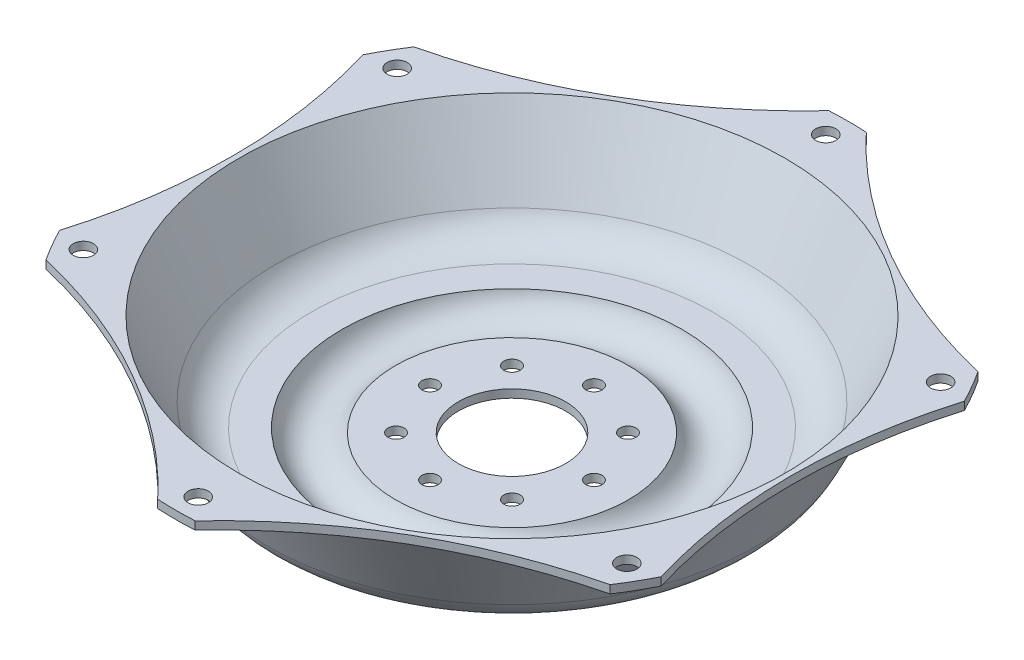
ISO-10303-21;
HEADER;
FILE_DESCRIPTION(('STEP AP214'),'2;1');
FILE_NAME('part.step','',(''),(''),'','','');
FILE_SCHEMA(('AUTOMOTIVE_DESIGN { 1 0 10303 214 1 1 1 1 }'));
ENDSEC;
DATA;
#1=APPLICATION_CONTEXT('core data for automotive mechanical design processes');
#2=APPLICATION_PROTOCOL_DEFINITION('international standard','automotive_design',2000,#1);
#3=PRODUCT_CONTEXT('',#1,'mechanical');
#4=PRODUCT('Part','Part','',(#3));
#5=PRODUCT_RELATED_PRODUCT_CATEGORY('part','',(#4));
#6=PRODUCT_DEFINITION_FORMATION('','',#4);
#7=PRODUCT_DEFINITION_CONTEXT('part definition',#1,'design');
#8=PRODUCT_DEFINITION('design','',#6,#7);
#9=PRODUCT_DEFINITION_SHAPE('','',#8);
#10=(LENGTH_UNIT() NAMED_UNIT(*) SI_UNIT(.MILLI.,.METRE.));
#11=(NAMED_UNIT(*) PLANE_ANGLE_UNIT() SI_UNIT($,.RADIAN.));
#12=(NAMED_UNIT(*) SI_UNIT($,.STERADIAN.) SOLID_ANGLE_UNIT());
#13=UNCERTAINTY_MEASURE_WITH_UNIT(LENGTH_MEASURE(1.E-05),#10,'distance_accuracy_value','');
#14=(GEOMETRIC_REPRESENTATION_CONTEXT(3) GLOBAL_UNCERTAINTY_ASSIGNED_CONTEXT((#13)) GLOBAL_UNIT_ASSIGNED_CONTEXT((#10,
#11,#12)) REPRESENTATION_CONTEXT('',''));
#15=CARTESIAN_POINT('',(0.,0.,0.));
#16=DIRECTION('',(0.,0.,1.));
#17=DIRECTION('',(1.,0.,0.));
#18=AXIS2_PLACEMENT_3D('',#15,#16,#17);
#19=CARTESIAN_POINT('',(0.,100.,0.));
#20=DIRECTION('',(0.,1.,0.));
#21=DIRECTION('',(0.,0.,1.));
#22=AXIS2_PLACEMENT_3D('',#19,#20,#21);
#23=CYLINDRICAL_SURFACE('',#22,332.5);
#24=CARTESIAN_POINT('',(0.,100.,0.));
#25=DIRECTION('',(0.,1.,0.));
#26=DIRECTION('',(0.,0.,1.));
#27=AXIS2_PLACEMENT_3D('',#24,#25,#26);
#28=CIRCLE('',#27,332.5);
#29=CARTESIAN_POINT('',(278.531193959891,100.,181.594669501276));
#30=VERTEX_POINT('',#29);
#31=CARTESIAN_POINT('',(296.953684892086,100.,149.581947537167));
#32=VERTEX_POINT('',#31);
#33=EDGE_CURVE('E159',#30,#32,#28,.T.);
#34=ORIENTED_EDGE('',*,*,#33,.F.);
#35=DIRECTION('',(0.,-1.,0.));
#36=VECTOR('',#35,1.);
#37=CARTESIAN_POINT('',(278.531193959891,100.,181.594669501276));
#38=LINE('',#37,#36);
#39=CARTESIAN_POINT('',(278.531193959891,92.,181.594669501276));
#40=VERTEX_POINT('',#39);
#41=EDGE_CURVE('E144',#30,#40,#38,.T.);
#42=ORIENTED_EDGE('',*,*,#41,.T.);
#43=CARTESIAN_POINT('',(0.,92.,0.));
#44=DIRECTION('',(0.,1.,0.));
#45=DIRECTION('',(0.,0.,1.));
#46=AXIS2_PLACEMENT_3D('',#43,#44,#45);
#47=CIRCLE('',#46,332.5);
#48=CARTESIAN_POINT('',(296.953684892086,92.,149.581947537167));
#49=VERTEX_POINT('',#48);
#50=EDGE_CURVE('E157',#40,#49,#47,.T.);
#51=ORIENTED_EDGE('',*,*,#50,.T.);
#52=DIRECTION('',(0.,-1.,0.));
#53=VECTOR('',#52,1.);
#54=CARTESIAN_POINT('',(296.953684892086,100.,149.581947537167));
#55=LINE('',#54,#53);
#56=EDGE_CURVE('E261',#32,#49,#55,.T.);
#57=ORIENTED_EDGE('',*,*,#56,.F.);
#58=EDGE_LOOP('',(#34,#42,#51,#57));
#59=FACE_BOUND('',#58,.T.);
#60=ADVANCED_FACE('F36',(#59),#23,.T.);
#61=CARTESIAN_POINT('',(-18.0000000000001,92.,332.012424466314));
#62=VERTEX_POINT('',#61);
#63=CARTESIAN_POINT('',(18.9350759313039,92.,331.960408632529));
#64=VERTEX_POINT('',#63);
#65=EDGE_CURVE('E165',#62,#64,#47,.T.);
#66=ORIENTED_EDGE('',*,*,#65,.T.);
#67=DIRECTION('',(0.,-1.,0.));
#68=VECTOR('',#67,1.);
#69=CARTESIAN_POINT('',(18.9350759313039,100.,331.960408632529));
#70=LINE('',#69,#68);
#71=CARTESIAN_POINT('',(18.9350759313039,100.,331.960408632529));
#72=VERTEX_POINT('',#71);
#73=EDGE_CURVE('E217',#72,#64,#70,.T.);
#74=ORIENTED_EDGE('',*,*,#73,.F.);
#75=CARTESIAN_POINT('',(-18.0000000000001,100.,332.012424466314));
#76=VERTEX_POINT('',#75);
#77=EDGE_CURVE('E207',#76,#72,#28,.T.);
#78=ORIENTED_EDGE('',*,*,#77,.F.);
#79=DIRECTION('',(0.,-1.,0.));
#80=VECTOR('',#79,1.);
#81=CARTESIAN_POINT('',(-18.0000000000001,100.,332.012424466314));
#82=LINE('',#81,#80);
#83=EDGE_CURVE('E221',#76,#62,#82,.T.);
#84=ORIENTED_EDGE('',*,*,#83,.T.);
#85=EDGE_LOOP('',(#66,#74,#78,#84));
#86=FACE_BOUND('',#85,.T.);
#87=ADVANCED_FACE('F395',(#86),#23,.T.);
#88=CARTESIAN_POINT('',(296.53119395989,100.,-150.417754965039));
#89=VERTEX_POINT('',#88);
#90=CARTESIAN_POINT('',(278.018608960782,100.,-182.37846109536));
#91=VERTEX_POINT('',#90);
#92=EDGE_CURVE('E426',#89,#91,#28,.T.);
#93=ORIENTED_EDGE('',*,*,#92,.F.);
#94=DIRECTION('',(0.,-1.,0.));
#95=VECTOR('',#94,1.);
#96=CARTESIAN_POINT('',(296.53119395989,100.,-150.417754965039));
#97=LINE('',#96,#95);
#98=CARTESIAN_POINT('',(296.53119395989,92.,-150.417754965039));
#99=VERTEX_POINT('',#98);
#100=EDGE_CURVE('E265',#89,#99,#97,.T.);
#101=ORIENTED_EDGE('',*,*,#100,.T.);
#102=CARTESIAN_POINT('',(278.018608960782,92.,-182.37846109536));
#103=VERTEX_POINT('',#102);
#104=EDGE_CURVE('E166',#99,#103,#47,.T.);
#105=ORIENTED_EDGE('',*,*,#104,.T.);
#106=DIRECTION('',(0.,-1.,0.));
#107=VECTOR('',#106,1.);
#108=CARTESIAN_POINT('',(278.018608960782,100.,-182.37846109536));
#109=LINE('',#108,#107);
#110=EDGE_CURVE('E251',#91,#103,#109,.T.);
#111=ORIENTED_EDGE('',*,*,#110,.F.);
#112=EDGE_LOOP('',(#93,#101,#105,#111));
#113=FACE_BOUND('',#112,.T.);
#114=ADVANCED_FACE('F400',(#113),#23,.T.);
#115=CARTESIAN_POINT('',(18.0000000000001,100.,-332.012424466314));
#116=VERTEX_POINT('',#115);
#117=CARTESIAN_POINT('',(-18.9350759313062,100.,-331.960408632529));
#118=VERTEX_POINT('',#117);
#119=EDGE_CURVE('E422',#116,#118,#28,.T.);
#120=ORIENTED_EDGE('',*,*,#119,.F.);
#121=DIRECTION('',(0.,-1.,0.));
#122=VECTOR('',#121,1.);
#123=CARTESIAN_POINT('',(18.0000000000001,100.,-332.012424466314));
#124=LINE('',#123,#122);
#125=CARTESIAN_POINT('',(18.0000000000001,92.,-332.012424466314));
#126=VERTEX_POINT('',#125);
#127=EDGE_CURVE('E255',#116,#126,#124,.T.);
#128=ORIENTED_EDGE('',*,*,#127,.T.);
#129=CARTESIAN_POINT('',(-18.9350759313062,92.,-331.960408632529));
#130=VERTEX_POINT('',#129);
#131=EDGE_CURVE('E171',#126,#130,#47,.T.);
#132=ORIENTED_EDGE('',*,*,#131,.T.);
#133=DIRECTION('',(0.,-1.,0.));
#134=VECTOR('',#133,1.);
#135=CARTESIAN_POINT('',(-18.9350759313062,100.,-331.960408632529));
#136=LINE('',#135,#134);
#137=EDGE_CURVE('E241',#118,#130,#136,.T.);
#138=ORIENTED_EDGE('',*,*,#137,.F.);
#139=EDGE_LOOP('',(#120,#128,#132,#138));
#140=FACE_BOUND('',#139,.T.);
#141=ADVANCED_FACE('F412',(#140),#23,.T.);
#142=CARTESIAN_POINT('',(-278.531193959892,100.,-181.594669501274));
#143=VERTEX_POINT('',#142);
#144=CARTESIAN_POINT('',(-296.953684892087,100.,-149.581947537165));
#145=VERTEX_POINT('',#144);
#146=EDGE_CURVE('E420',#143,#145,#28,.T.);
#147=ORIENTED_EDGE('',*,*,#146,.F.);
#148=DIRECTION('',(0.,-1.,0.));
#149=VECTOR('',#148,1.);
#150=CARTESIAN_POINT('',(-278.531193959892,100.,-181.594669501274));
#151=LINE('',#150,#149);
#152=CARTESIAN_POINT('',(-278.531193959892,92.,-181.594669501274));
#153=VERTEX_POINT('',#152);
#154=EDGE_CURVE('E246',#143,#153,#151,.T.);
#155=ORIENTED_EDGE('',*,*,#154,.T.);
#156=CARTESIAN_POINT('',(-296.953684892087,92.,-149.581947537165));
#157=VERTEX_POINT('',#156);
#158=EDGE_CURVE('E858',#153,#157,#47,.T.);
#159=ORIENTED_EDGE('',*,*,#158,.T.);
#160=DIRECTION('',(0.,-1.,0.));
#161=VECTOR('',#160,1.);
#162=CARTESIAN_POINT('',(-296.953684892087,100.,-149.581947537165));
#163=LINE('',#162,#161);
#164=EDGE_CURVE('E232',#145,#157,#163,.T.);
#165=ORIENTED_EDGE('',*,*,#164,.F.);
#166=EDGE_LOOP('',(#147,#155,#159,#165));
#167=FACE_BOUND('',#166,.T.);
#168=ADVANCED_FACE('F404',(#167),#23,.T.);
#169=CARTESIAN_POINT('',(-296.531193959889,100.,150.417754965041));
#170=VERTEX_POINT('',#169);
#171=CARTESIAN_POINT('',(-278.018608960782,100.,182.37846109536));
#172=VERTEX_POINT('',#171);
#173=EDGE_CURVE('E210',#170,#172,#28,.T.);
#174=ORIENTED_EDGE('',*,*,#173,.F.);
#175=DIRECTION('',(0.,-1.,0.));
#176=VECTOR('',#175,1.);
#177=CARTESIAN_POINT('',(-296.531193959889,100.,150.417754965041));
#178=LINE('',#177,#176);
#179=CARTESIAN_POINT('',(-296.531193959889,92.,150.417754965041));
#180=VERTEX_POINT('',#179);
#181=EDGE_CURVE('E236',#170,#180,#178,.T.);
#182=ORIENTED_EDGE('',*,*,#181,.T.);
#183=CARTESIAN_POINT('',(-278.018608960782,92.,182.37846109536));
#184=VERTEX_POINT('',#183);
#185=EDGE_CURVE('E169',#180,#184,#47,.T.);
#186=ORIENTED_EDGE('',*,*,#185,.T.);
#187=DIRECTION('',(0.,-1.,0.));
#188=VECTOR('',#187,1.);
#189=CARTESIAN_POINT('',(-278.018608960782,100.,182.37846109536));
#190=LINE('',#189,#188);
#191=EDGE_CURVE('E224',#172,#184,#190,.T.);
#192=ORIENTED_EDGE('',*,*,#191,.F.);
#193=EDGE_LOOP('',(#174,#182,#186,#192));
#194=FACE_BOUND('',#193,.T.);
#195=ADVANCED_FACE('F396',(#194),#23,.T.);
#196=CARTESIAN_POINT('',(269.721959046056,92.,0.));
#197=DIRECTION('',(0.,1.,0.));
#198=DIRECTION('',(0.,0.,1.));
#199=AXIS2_PLACEMENT_3D('',#196,#197,#198);
#200=PLANE('',#199);
#201=CARTESIAN_POINT('',(399.265539041086,92.,689.304522403098));
#202=DIRECTION('',(0.,-1.,0.));
#203=DIRECTION('',(-0.86602540378444,0.,-0.499999999999998));
#204=AXIS2_PLACEMENT_3D('',#201,#202,#203);
#205=CIRCLE('',#204,521.867872948484);
#206=CARTESIAN_POINT('',(137.695377558574,92.,237.721609265558));
#207=VERTEX_POINT('',#206);
#208=EDGE_CURVE('E147',#207,#64,#205,.F.);
#209=ORIENTED_EDGE('',*,*,#208,.T.);
#210=ORIENTED_EDGE('',*,*,#65,.F.);
#211=CARTESIAN_POINT('',(-397.322457824042,92.,690.426360866816));
#212=DIRECTION('',(0.,-1.,0.));
#213=DIRECTION('',(0.,0.,-1.));
#214=AXIS2_PLACEMENT_3D('',#211,#212,#213);
#215=CIRCLE('',#214,521.867872948484);
#216=CARTESIAN_POINT('',(-137.025263873205,92.,238.108499582194));
#217=VERTEX_POINT('',#216);
#218=EDGE_CURVE('E220',#62,#217,#215,.F.);
#219=ORIENTED_EDGE('',*,*,#218,.T.);
#220=CARTESIAN_POINT('',(0.,92.,0.));
#221=DIRECTION('',(0.,1.,0.));
#222=DIRECTION('',(0.,0.,1.));
#223=AXIS2_PLACEMENT_3D('',#220,#221,#222);
#224=CIRCLE('',#223,274.720913861331);
#225=EDGE_CURVE('E178',#217,#207,#224,.T.);
#226=ORIENTED_EDGE('',*,*,#225,.T.);
#227=EDGE_LOOP('',(#209,#210,#219,#226));
#228=FACE_BOUND('',#227,.T.);
#229=CARTESIAN_POINT('',(0.,92.,310.));
#230=DIRECTION('',(0.,-1.,0.));
#231=DIRECTION('',(0.,0.,-1.));
#232=AXIS2_PLACEMENT_3D('',#229,#230,#231);
#233=CIRCLE('',#232,10.);
#234=CARTESIAN_POINT('',(0.,92.,300.));
#235=VERTEX_POINT('',#234);
#236=EDGE_CURVE('E213',#235,#235,#233,.T.);
#237=ORIENTED_EDGE('',*,*,#236,.F.);
#238=EDGE_LOOP('',(#237));
#239=FACE_BOUND('',#238,.T.);
#240=ADVANCED_FACE('F403',(#228,#239),#200,.F.);
#241=CARTESIAN_POINT('',(268.467875173176,92.,154.999999999999));
#242=DIRECTION('',(0.,-1.,0.));
#243=DIRECTION('',(-0.86602540378444,0.,-0.499999999999998));
#244=AXIS2_PLACEMENT_3D('',#241,#242,#243);
#245=CIRCLE('',#244,10.);
#246=CARTESIAN_POINT('',(259.807621135332,92.,149.999999999999));
#247=VERTEX_POINT('',#246);
#248=EDGE_CURVE('E273',#247,#247,#245,.T.);
#249=ORIENTED_EDGE('',*,*,#248,.F.);
#250=EDGE_LOOP('',(#249));
#251=FACE_BOUND('',#250,.T.);
#252=EDGE_CURVE('E141',#40,#207,#205,.F.);
#253=ORIENTED_EDGE('',*,*,#252,.T.);
#254=CARTESIAN_POINT('',(274.720641431778,92.,-0.386890316636765));
#255=VERTEX_POINT('',#254);
#256=EDGE_CURVE('E181',#207,#255,#224,.T.);
#257=ORIENTED_EDGE('',*,*,#256,.T.);
#258=CARTESIAN_POINT('',(796.587996865126,92.,-1.12183846372071));
#259=DIRECTION('',(0.,-1.,0.));
#260=DIRECTION('',(-0.866025403784436,0.,0.500000000000004));
#261=AXIS2_PLACEMENT_3D('',#258,#259,#260);
#262=CIRCLE('',#261,521.867872948484);
#263=EDGE_CURVE('E164',#255,#49,#262,.F.);
#264=ORIENTED_EDGE('',*,*,#263,.T.);
#265=ORIENTED_EDGE('',*,*,#50,.F.);
#266=EDGE_LOOP('',(#253,#257,#264,#265));
#267=FACE_BOUND('',#266,.T.);
#268=ADVANCED_FACE('F163',(#251,#267),#200,.F.);
#269=CARTESIAN_POINT('',(268.467875173175,92.,-155.000000000001));
#270=DIRECTION('',(0.,-1.,0.));
#271=DIRECTION('',(-0.866025403784436,0.,0.500000000000004));
#272=AXIS2_PLACEMENT_3D('',#269,#270,#271);
#273=CIRCLE('',#272,10.);
#274=CARTESIAN_POINT('',(259.807621135331,92.,-150.000000000001));
#275=VERTEX_POINT('',#274);
#276=EDGE_CURVE('E279',#275,#275,#273,.T.);
#277=ORIENTED_EDGE('',*,*,#276,.F.);
#278=EDGE_LOOP('',(#277));
#279=FACE_BOUND('',#278,.T.);
#280=EDGE_CURVE('E268',#99,#255,#262,.F.);
#281=ORIENTED_EDGE('',*,*,#280,.T.);
#282=CARTESIAN_POINT('',(137.025263873205,92.,-238.108499582194));
#283=VERTEX_POINT('',#282);
#284=EDGE_CURVE('E447',#255,#283,#224,.T.);
#285=ORIENTED_EDGE('',*,*,#284,.T.);
#286=CARTESIAN_POINT('',(397.322457824042,92.,-690.426360866816));
#287=DIRECTION('',(0.,-1.,0.));
#288=DIRECTION('',(0.,0.,1.));
#289=AXIS2_PLACEMENT_3D('',#286,#287,#288);
#290=CIRCLE('',#289,521.867872948484);
#291=EDGE_CURVE('E243',#283,#103,#290,.F.);
#292=ORIENTED_EDGE('',*,*,#291,.T.);
#293=ORIENTED_EDGE('',*,*,#104,.F.);
#294=EDGE_LOOP('',(#281,#285,#292,#293));
#295=FACE_BOUND('',#294,.T.);
#296=ADVANCED_FACE('F584',(#279,#295),#200,.F.);
#297=CARTESIAN_POINT('',(0.,92.,-310.));
#298=DIRECTION('',(0.,-1.,0.));
#299=DIRECTION('',(0.,0.,1.));
#300=AXIS2_PLACEMENT_3D('',#297,#298,#299);
#301=CIRCLE('',#300,10.);
#302=CARTESIAN_POINT('',(0.,92.,-300.));
#303=VERTEX_POINT('',#302);
#304=EDGE_CURVE('E294',#303,#303,#301,.T.);
#305=ORIENTED_EDGE('',*,*,#304,.F.);
#306=EDGE_LOOP('',(#305));
#307=FACE_BOUND('',#306,.T.);
#308=EDGE_CURVE('E258',#126,#283,#290,.F.);
#309=ORIENTED_EDGE('',*,*,#308,.T.);
#310=CARTESIAN_POINT('',(-137.695377558576,92.,-237.721609265557));
#311=VERTEX_POINT('',#310);
#312=EDGE_CURVE('E448',#283,#311,#224,.T.);
#313=ORIENTED_EDGE('',*,*,#312,.T.);
#314=CARTESIAN_POINT('',(-399.265539041091,92.,-689.304522403096));
#315=DIRECTION('',(0.,-1.,0.));
#316=DIRECTION('',(0.866025403784443,0.,0.499999999999992));
#317=AXIS2_PLACEMENT_3D('',#314,#315,#316);
#318=CIRCLE('',#317,521.867872948484);
#319=EDGE_CURVE('E58',#311,#130,#318,.F.);
#320=ORIENTED_EDGE('',*,*,#319,.T.);
#321=ORIENTED_EDGE('',*,*,#131,.F.);
#322=EDGE_LOOP('',(#309,#313,#320,#321));
#323=FACE_BOUND('',#322,.T.);
#324=ADVANCED_FACE('F576',(#307,#323),#200,.F.);
#325=CARTESIAN_POINT('',(-268.467875173177,92.,-154.999999999997));
#326=DIRECTION('',(0.,-1.,0.));
#327=DIRECTION('',(0.866025403784443,0.,0.499999999999992));
#328=AXIS2_PLACEMENT_3D('',#325,#326,#327);
#329=CIRCLE('',#328,10.);
#330=CARTESIAN_POINT('',(-259.807621135333,92.,-149.999999999998));
#331=VERTEX_POINT('',#330);
#332=EDGE_CURVE('E288',#331,#331,#329,.T.);
#333=ORIENTED_EDGE('',*,*,#332,.F.);
#334=EDGE_LOOP('',(#333));
#335=FACE_BOUND('',#334,.T.);
#336=EDGE_CURVE('E249',#153,#311,#318,.F.);
#337=ORIENTED_EDGE('',*,*,#336,.T.);
#338=CARTESIAN_POINT('',(-274.720641431778,92.,0.386890316638699));
#339=VERTEX_POINT('',#338);
#340=EDGE_CURVE('E452',#311,#339,#224,.T.);
#341=ORIENTED_EDGE('',*,*,#340,.T.);
#342=CARTESIAN_POINT('',(-796.587996865126,92.,1.12183846372632));
#343=DIRECTION('',(0.,-1.,0.));
#344=DIRECTION('',(0.866025403784433,0.,-0.50000000000001));
#345=AXIS2_PLACEMENT_3D('',#342,#343,#344);
#346=CIRCLE('',#345,521.867872948484);
#347=EDGE_CURVE('E50',#339,#157,#346,.F.);
#348=ORIENTED_EDGE('',*,*,#347,.T.);
#349=ORIENTED_EDGE('',*,*,#158,.F.);
#350=EDGE_LOOP('',(#337,#341,#348,#349));
#351=FACE_BOUND('',#350,.T.);
#352=ADVANCED_FACE('F474',(#335,#351),#200,.F.);
#353=CARTESIAN_POINT('',(269.721959046056,100.,0.));
#354=DIRECTION('',(0.,1.,0.));
#355=DIRECTION('',(0.,0.,1.));
#356=AXIS2_PLACEMENT_3D('',#353,#354,#355);
#357=PLANE('',#356);
#358=CARTESIAN_POINT('',(-268.467875173174,100.,155.000000000003));
#359=DIRECTION('',(0.,-1.,0.));
#360=DIRECTION('',(0.866025403784433,0.,-0.50000000000001));
#361=AXIS2_PLACEMENT_3D('',#358,#359,#360);
#362=CIRCLE('',#361,10.);
#363=CARTESIAN_POINT('',(-259.80762113533,100.,150.000000000003));
#364=VERTEX_POINT('',#363);
#365=EDGE_CURVE('E284',#364,#364,#362,.T.);
#366=ORIENTED_EDGE('',*,*,#365,.T.);
#367=EDGE_LOOP('',(#366));
#368=FACE_BOUND('',#367,.T.);
#369=CARTESIAN_POINT('',(-268.467875173177,100.,-154.999999999997));
#370=DIRECTION('',(0.,-1.,0.));
#371=DIRECTION('',(0.866025403784443,0.,0.499999999999992));
#372=AXIS2_PLACEMENT_3D('',#369,#370,#371);
#373=CIRCLE('',#372,10.);
#374=CARTESIAN_POINT('',(-259.807621135333,100.,-149.999999999998));
#375=VERTEX_POINT('',#374);
#376=EDGE_CURVE('E283',#375,#375,#373,.T.);
#377=ORIENTED_EDGE('',*,*,#376,.T.);
#378=EDGE_LOOP('',(#377));
#379=FACE_BOUND('',#378,.T.);
#380=CARTESIAN_POINT('',(0.,100.,-310.));
#381=DIRECTION('',(0.,-1.,0.));
#382=DIRECTION('',(0.,0.,1.));
#383=AXIS2_PLACEMENT_3D('',#380,#381,#382);
#384=CIRCLE('',#383,10.);
#385=CARTESIAN_POINT('',(0.,100.,-300.));
#386=VERTEX_POINT('',#385);
#387=EDGE_CURVE('E291',#386,#386,#384,.T.);
#388=ORIENTED_EDGE('',*,*,#387,.T.);
#389=EDGE_LOOP('',(#388));
#390=FACE_BOUND('',#389,.T.);
#391=CARTESIAN_POINT('',(268.467875173175,100.,-155.000000000001));
#392=DIRECTION('',(0.,-1.,0.));
#393=DIRECTION('',(-0.866025403784436,0.,0.500000000000004));
#394=AXIS2_PLACEMENT_3D('',#391,#392,#393);
#395=CIRCLE('',#394,10.);
#396=CARTESIAN_POINT('',(259.807621135331,100.,-150.000000000001));
#397=VERTEX_POINT('',#396);
#398=EDGE_CURVE('E297',#397,#397,#395,.T.);
#399=ORIENTED_EDGE('',*,*,#398,.T.);
#400=EDGE_LOOP('',(#399));
#401=FACE_BOUND('',#400,.T.);
#402=CARTESIAN_POINT('',(268.467875173176,100.,154.999999999999));
#403=DIRECTION('',(0.,-1.,0.));
#404=DIRECTION('',(-0.86602540378444,0.,-0.499999999999998));
#405=AXIS2_PLACEMENT_3D('',#402,#403,#404);
#406=CIRCLE('',#405,10.);
#407=CARTESIAN_POINT('',(259.807621135332,100.,149.999999999999));
#408=VERTEX_POINT('',#407);
#409=EDGE_CURVE('E276',#408,#408,#406,.T.);
#410=ORIENTED_EDGE('',*,*,#409,.T.);
#411=EDGE_LOOP('',(#410));
#412=FACE_BOUND('',#411,.T.);
#413=CARTESIAN_POINT('',(0.,100.,310.));
#414=DIRECTION('',(0.,-1.,0.));
#415=DIRECTION('',(0.,0.,-1.));
#416=AXIS2_PLACEMENT_3D('',#413,#414,#415);
#417=CIRCLE('',#416,10.);
#418=CARTESIAN_POINT('',(0.,100.,300.));
#419=VERTEX_POINT('',#418);
#420=EDGE_CURVE('E216',#419,#419,#417,.T.);
#421=ORIENTED_EDGE('',*,*,#420,.T.);
#422=EDGE_LOOP('',(#421));
#423=FACE_BOUND('',#422,.T.);
#424=CARTESIAN_POINT('',(0.,100.,0.));
#425=DIRECTION('',(0.,1.,0.));
#426=DIRECTION('',(0.,0.,1.));
#427=AXIS2_PLACEMENT_3D('',#424,#425,#426);
#428=CIRCLE('',#427,269.721959046056);
#429=CARTESIAN_POINT('',(0.,100.,269.721959046056));
#430=VERTEX_POINT('',#429);
#431=EDGE_CURVE('E176',#430,#430,#428,.T.);
#432=ORIENTED_EDGE('',*,*,#431,.F.);
#433=EDGE_LOOP('',(#432));
#434=FACE_BOUND('',#433,.T.);
#435=ORIENTED_EDGE('',*,*,#77,.T.);
#436=CARTESIAN_POINT('',(399.265539041086,100.,689.304522403098));
#437=DIRECTION('',(0.,-1.,0.));
#438=DIRECTION('',(-0.86602540378444,0.,-0.499999999999998));
#439=AXIS2_PLACEMENT_3D('',#436,#437,#438);
#440=CIRCLE('',#439,521.867872948484);
#441=EDGE_CURVE('E160',#30,#72,#440,.F.);
#442=ORIENTED_EDGE('',*,*,#441,.F.);
#443=ORIENTED_EDGE('',*,*,#33,.T.);
#444=CARTESIAN_POINT('',(796.587996865126,100.,-1.12183846372071));
#445=DIRECTION('',(0.,-1.,0.));
#446=DIRECTION('',(-0.866025403784436,0.,0.500000000000004));
#447=AXIS2_PLACEMENT_3D('',#444,#445,#446);
#448=CIRCLE('',#447,521.867872948484);
#449=EDGE_CURVE('E263',#89,#32,#448,.F.);
#450=ORIENTED_EDGE('',*,*,#449,.F.);
#451=ORIENTED_EDGE('',*,*,#92,.T.);
#452=CARTESIAN_POINT('',(397.322457824042,100.,-690.426360866816));
#453=DIRECTION('',(0.,-1.,0.));
#454=DIRECTION('',(0.,0.,1.));
#455=AXIS2_PLACEMENT_3D('',#452,#453,#454);
#456=CIRCLE('',#455,521.867872948484);
#457=EDGE_CURVE('E253',#116,#91,#456,.F.);
#458=ORIENTED_EDGE('',*,*,#457,.F.);
#459=ORIENTED_EDGE('',*,*,#119,.T.);
#460=CARTESIAN_POINT('',(-399.265539041091,100.,-689.304522403096));
#461=DIRECTION('',(0.,-1.,0.));
#462=DIRECTION('',(0.866025403784443,0.,0.499999999999992));
#463=AXIS2_PLACEMENT_3D('',#460,#461,#462);
#464=CIRCLE('',#463,521.867872948484);
#465=EDGE_CURVE('E244',#143,#118,#464,.F.);
#466=ORIENTED_EDGE('',*,*,#465,.F.);
#467=ORIENTED_EDGE('',*,*,#146,.T.);
#468=CARTESIAN_POINT('',(-796.587996865126,100.,1.12183846372632));
#469=DIRECTION('',(0.,-1.,0.));
#470=DIRECTION('',(0.866025403784433,0.,-0.50000000000001));
#471=AXIS2_PLACEMENT_3D('',#468,#469,#470);
#472=CIRCLE('',#471,521.867872948484);
#473=EDGE_CURVE('E234',#170,#145,#472,.F.);
#474=ORIENTED_EDGE('',*,*,#473,.F.);
#475=ORIENTED_EDGE('',*,*,#173,.T.);
#476=CARTESIAN_POINT('',(-397.322457824042,100.,690.426360866816));
#477=DIRECTION('',(0.,-1.,0.));
#478=DIRECTION('',(0.,0.,-1.));
#479=AXIS2_PLACEMENT_3D('',#476,#477,#478);
#480=CIRCLE('',#479,521.867872948484);
#481=EDGE_CURVE('E225',#76,#172,#480,.F.);
#482=ORIENTED_EDGE('',*,*,#481,.F.);
#483=EDGE_LOOP('',(#435,#442,#443,#450,#451,#458,#459,#466,#467,#474,#475,#482));
#484=FACE_BOUND('',#483,.T.);
#485=ADVANCED_FACE('F432',(#368,#379,#390,#401,#412,#423,#434,#484),#357,.T.);
#486=CARTESIAN_POINT('',(-268.467875173174,92.,155.000000000003));
#487=DIRECTION('',(0.,-1.,0.));
#488=DIRECTION('',(0.866025403784433,0.,-0.50000000000001));
#489=AXIS2_PLACEMENT_3D('',#486,#487,#488);
#490=CIRCLE('',#489,10.);
#491=CARTESIAN_POINT('',(-259.80762113533,92.,150.000000000003));
#492=VERTEX_POINT('',#491);
#493=EDGE_CURVE('E280',#492,#492,#490,.T.);
#494=ORIENTED_EDGE('',*,*,#493,.F.);
#495=EDGE_LOOP('',(#494));
#496=FACE_BOUND('',#495,.T.);
#497=EDGE_CURVE('E239',#180,#339,#346,.F.);
#498=ORIENTED_EDGE('',*,*,#497,.T.);
#499=EDGE_CURVE('E182',#339,#217,#224,.T.);
#500=ORIENTED_EDGE('',*,*,#499,.T.);
#501=CARTESIAN_POINT('',(-397.322457824042,92.,690.426360866816));
#502=DIRECTION('',(0.,1.,0.));
#503=DIRECTION('',(0.,0.,1.));
#504=AXIS2_PLACEMENT_3D('',#501,#502,#503);
#505=CIRCLE('',#504,521.867872948484);
#506=EDGE_CURVE('E12',#184,#217,#505,.F.);
#507=ORIENTED_EDGE('',*,*,#506,.F.);
#508=ORIENTED_EDGE('',*,*,#185,.F.);
#509=EDGE_LOOP('',(#498,#500,#507,#508));
#510=FACE_BOUND('',#509,.T.);
#511=ADVANCED_FACE('F374',(#496,#510),#200,.F.);
#512=CARTESIAN_POINT('',(0.,0.,0.));
#513=DIRECTION('',(0.,1.,0.));
#514=DIRECTION('',(0.,0.,1.));
#515=AXIS2_PLACEMENT_3D('',#512,#513,#514);
#516=CYLINDRICAL_SURFACE('',#515,53.);
#517=CARTESIAN_POINT('',(0.,0.,0.));
#518=DIRECTION('',(0.,1.,0.));
#519=DIRECTION('',(0.,0.,1.));
#520=AXIS2_PLACEMENT_3D('',#517,#518,#519);
#521=CIRCLE('',#520,53.);
#522=CARTESIAN_POINT('',(0.,0.,53.));
#523=VERTEX_POINT('',#522);
#524=EDGE_CURVE('E43',#523,#523,#521,.T.);
#525=ORIENTED_EDGE('',*,*,#524,.T.);
#526=EDGE_LOOP('',(#525));
#527=FACE_BOUND('',#526,.T.);
#528=CARTESIAN_POINT('',(0.,-8.,0.));
#529=DIRECTION('',(0.,1.,0.));
#530=DIRECTION('',(0.,0.,1.));
#531=AXIS2_PLACEMENT_3D('',#528,#529,#530);
#532=CIRCLE('',#531,53.);
#533=CARTESIAN_POINT('',(0.,-8.,53.));
#534=VERTEX_POINT('',#533);
#535=EDGE_CURVE('E173',#534,#534,#532,.T.);
#536=ORIENTED_EDGE('',*,*,#535,.F.);
#537=EDGE_LOOP('',(#536));
#538=FACE_BOUND('',#537,.T.);
#539=ADVANCED_FACE('F359',(#527,#538),#516,.F.);
#540=CARTESIAN_POINT('',(53.,0.,0.));
#541=DIRECTION('',(0.,1.,0.));
#542=DIRECTION('',(0.,0.,1.));
#543=AXIS2_PLACEMENT_3D('',#540,#541,#542);
#544=PLANE('',#543);
#545=CARTESIAN_POINT('',(-81.,0.,2.82809988446294E-13));
#546=DIRECTION('',(0.,1.,0.));
#547=DIRECTION('',(1.,0.,0.));
#548=AXIS2_PLACEMENT_3D('',#545,#546,#547);
#549=CIRCLE('',#548,7.99999999999999);
#550=CARTESIAN_POINT('',(-73.,0.,2.54878137735549E-13));
#551=VERTEX_POINT('',#550);
#552=EDGE_CURVE('E333',#551,#551,#549,.T.);
#553=ORIENTED_EDGE('',*,*,#552,.F.);
#554=EDGE_LOOP('',(#553));
#555=FACE_BOUND('',#554,.T.);
#556=CARTESIAN_POINT('',(-57.2756492761101,0.,57.2756492761107));
#557=DIRECTION('',(0.,1.,0.));
#558=DIRECTION('',(0.707106781186544,0.,-0.707106781186551));
#559=AXIS2_PLACEMENT_3D('',#556,#557,#558);
#560=CIRCLE('',#559,7.99999999999999);
#561=CARTESIAN_POINT('',(-51.6187950266177,0.,51.6187950266183));
#562=VERTEX_POINT('',#561);
#563=EDGE_CURVE('E327',#562,#562,#560,.T.);
#564=ORIENTED_EDGE('',*,*,#563,.F.);
#565=EDGE_LOOP('',(#564));
#566=FACE_BOUND('',#565,.T.);
#567=CARTESIAN_POINT('',(0.,0.,81.));
#568=DIRECTION('',(0.,1.,0.));
#569=DIRECTION('',(0.,0.,-1.));
#570=AXIS2_PLACEMENT_3D('',#567,#568,#569);
#571=CIRCLE('',#570,7.99999999999999);
#572=CARTESIAN_POINT('',(0.,0.,73.));
#573=VERTEX_POINT('',#572);
#574=EDGE_CURVE('E319',#573,#573,#571,.T.);
#575=ORIENTED_EDGE('',*,*,#574,.F.);
#576=EDGE_LOOP('',(#575));
#577=FACE_BOUND('',#576,.T.);
#578=CARTESIAN_POINT('',(57.2756492761108,0.,57.2756492761098));
#579=DIRECTION('',(0.,1.,0.));
#580=DIRECTION('',(-0.707106781186554,0.,-0.707106781186541));
#581=AXIS2_PLACEMENT_3D('',#578,#579,#580);
#582=CIRCLE('',#581,7.99999999999999);
#583=CARTESIAN_POINT('',(51.6187950266184,0.,51.6187950266175));
#584=VERTEX_POINT('',#583);
#585=EDGE_CURVE('E320',#584,#584,#582,.T.);
#586=ORIENTED_EDGE('',*,*,#585,.F.);
#587=EDGE_LOOP('',(#586));
#588=FACE_BOUND('',#587,.T.);
#589=CARTESIAN_POINT('',(81.,0.,-8.48429965338881E-13));
#590=DIRECTION('',(0.,1.,0.));
#591=DIRECTION('',(-1.,0.,0.));
#592=AXIS2_PLACEMENT_3D('',#589,#590,#591);
#593=CIRCLE('',#592,7.99999999999999);
#594=CARTESIAN_POINT('',(73.,0.,-7.64634413206646E-13));
#595=VERTEX_POINT('',#594);
#596=EDGE_CURVE('E343',#595,#595,#593,.T.);
#597=ORIENTED_EDGE('',*,*,#596,.F.);
#598=EDGE_LOOP('',(#597));
#599=FACE_BOUND('',#598,.T.);
#600=CARTESIAN_POINT('',(57.2756492761097,0.,-57.275649276111));
#601=DIRECTION('',(0.,1.,0.));
#602=DIRECTION('',(-0.707106781186539,0.,0.707106781186556));
#603=AXIS2_PLACEMENT_3D('',#600,#601,#602);
#604=CIRCLE('',#603,7.99999999999999);
#605=CARTESIAN_POINT('',(51.6187950266173,0.,-51.6187950266186));
#606=VERTEX_POINT('',#605);
#607=EDGE_CURVE('E344',#606,#606,#604,.T.);
#608=ORIENTED_EDGE('',*,*,#607,.F.);
#609=EDGE_LOOP('',(#608));
#610=FACE_BOUND('',#609,.T.);
#611=CARTESIAN_POINT('',(-57.2756492761104,0.,-57.2756492761103));
#612=DIRECTION('',(0.,1.,0.));
#613=DIRECTION('',(0.707106781186549,0.,0.707106781186546));
#614=AXIS2_PLACEMENT_3D('',#611,#612,#613);
#615=CIRCLE('',#614,7.99999999999999);
#616=CARTESIAN_POINT('',(-51.6187950266181,0.,-51.6187950266179));
#617=VERTEX_POINT('',#616);
#618=EDGE_CURVE('E312',#617,#617,#615,.T.);
#619=ORIENTED_EDGE('',*,*,#618,.F.);
#620=EDGE_LOOP('',(#619));
#621=FACE_BOUND('',#620,.T.);
#622=CARTESIAN_POINT('',(0.,0.,-81.));
#623=DIRECTION('',(0.,1.,0.));
#624=DIRECTION('',(0.,0.,1.));
#625=AXIS2_PLACEMENT_3D('',#622,#623,#624);
#626=CIRCLE('',#625,7.99999999999999);
#627=CARTESIAN_POINT('',(0.,0.,-73.));
#628=VERTEX_POINT('',#627);
#629=EDGE_CURVE('E306',#628,#628,#626,.T.);
#630=ORIENTED_EDGE('',*,*,#629,.F.);
#631=EDGE_LOOP('',(#630));
#632=FACE_BOUND('',#631,.T.);
#633=CARTESIAN_POINT('',(0.,0.,0.));
#634=DIRECTION('',(0.,1.,0.));
#635=DIRECTION('',(0.,0.,1.));
#636=AXIS2_PLACEMENT_3D('',#633,#634,#635);
#637=CIRCLE('',#636,115.);
#638=CARTESIAN_POINT('',(0.,0.,115.));
#639=VERTEX_POINT('',#638);
#640=EDGE_CURVE('E195',#639,#639,#637,.T.);
#641=ORIENTED_EDGE('',*,*,#640,.T.);
#642=EDGE_LOOP('',(#641));
#643=FACE_BOUND('',#642,.T.);
#644=ORIENTED_EDGE('',*,*,#524,.F.);
#645=EDGE_LOOP('',(#644));
#646=FACE_BOUND('',#645,.T.);
#647=ADVANCED_FACE('F355',(#555,#566,#577,#588,#599,#610,#621,#632,#643,#646),#544,.T.);
#648=CARTESIAN_POINT('',(0.,12.3125455920112,0.));
#649=DIRECTION('',(0.,1.,0.));
#650=DIRECTION('',(0.,0.,1.));
#651=AXIS2_PLACEMENT_3D('',#648,#649,#650);
#652=TOROIDAL_SURFACE('',#651,140.703136404817,28.5);
#653=CARTESIAN_POINT('',(0.,4.31254559201118,0.));
#654=DIRECTION('',(0.,1.,0.));
#655=DIRECTION('',(0.,0.,1.));
#656=AXIS2_PLACEMENT_3D('',#653,#654,#655);
#657=CIRCLE('',#656,168.057295137997);
#658=CARTESIAN_POINT('',(0.,4.31254559201118,168.057295137997));
#659=VERTEX_POINT('',#658);
#660=EDGE_CURVE('E198',#659,#659,#657,.T.);
#661=ORIENTED_EDGE('',*,*,#660,.T.);
#662=EDGE_LOOP('',(#661));
#663=FACE_BOUND('',#662,.T.);
#664=ORIENTED_EDGE('',*,*,#640,.F.);
#665=EDGE_LOOP('',(#664));
#666=FACE_BOUND('',#665,.T.);
#667=ADVANCED_FACE('F358',(#663,#666),#652,.F.);
#668=CARTESIAN_POINT('',(168.057295137997,4.31254559201118,0.));
#669=DIRECTION('',(0.,1.,0.));
#670=DIRECTION('',(0.,0.,1.));
#671=AXIS2_PLACEMENT_3D('',#668,#669,#670);
#672=PLANE('',#671);
#673=CARTESIAN_POINT('',(0.,4.31254559201118,0.));
#674=DIRECTION('',(0.,1.,0.));
#675=DIRECTION('',(0.,0.,1.));
#676=AXIS2_PLACEMENT_3D('',#673,#674,#675);
#677=CIRCLE('',#676,198.057295137997);
#678=CARTESIAN_POINT('',(0.,4.31254559201118,198.057295137997));
#679=VERTEX_POINT('',#678);
#680=EDGE_CURVE('E201',#679,#679,#677,.T.);
#681=ORIENTED_EDGE('',*,*,#680,.T.);
#682=EDGE_LOOP('',(#681));
#683=FACE_BOUND('',#682,.T.);
#684=ORIENTED_EDGE('',*,*,#660,.F.);
#685=EDGE_LOOP('',(#684));
#686=FACE_BOUND('',#685,.T.);
#687=ADVANCED_FACE('F479',(#683,#686),#672,.T.);
#688=CARTESIAN_POINT('',(0.,44.3125455920112,0.));
#689=DIRECTION('',(0.,1.,0.));
#690=DIRECTION('',(0.,0.,1.));
#691=AXIS2_PLACEMENT_3D('',#688,#689,#690);
#692=TOROIDAL_SURFACE('',#691,198.057295137997,40.);
#693=CARTESIAN_POINT('',(0.,26.7776997204482,0.));
#694=DIRECTION('',(0.,1.,0.));
#695=DIRECTION('',(0.,0.,1.));
#696=AXIS2_PLACEMENT_3D('',#693,#694,#695);
#697=CIRCLE('',#696,234.009056989964);
#698=CARTESIAN_POINT('',(0.,26.7776997204482,234.009056989964));
#699=VERTEX_POINT('',#698);
#700=EDGE_CURVE('E204',#699,#699,#697,.T.);
#701=ORIENTED_EDGE('',*,*,#700,.T.);
#702=EDGE_LOOP('',(#701));
#703=FACE_BOUND('',#702,.T.);
#704=ORIENTED_EDGE('',*,*,#680,.F.);
#705=EDGE_LOOP('',(#704));
#706=FACE_BOUND('',#705,.T.);
#707=ADVANCED_FACE('F390',(#703,#706),#692,.F.);
#708=CARTESIAN_POINT('',(0.,26.7776997204482,0.));
#709=DIRECTION('',(0.,1.,0.));
#710=DIRECTION('',(0.,0.,1.));
#711=AXIS2_PLACEMENT_3D('',#708,#709,#710);
#712=CONICAL_SURFACE('',#711,234.009056989964,0.453785605518523);
#713=ORIENTED_EDGE('',*,*,#431,.T.);
#714=EDGE_LOOP('',(#713));
#715=FACE_BOUND('',#714,.T.);
#716=ORIENTED_EDGE('',*,*,#700,.F.);
#717=EDGE_LOOP('',(#716));
#718=FACE_BOUND('',#717,.T.);
#719=ADVANCED_FACE('F380',(#715,#718),#712,.F.);
#720=CARTESIAN_POINT('',(53.,-8.,0.));
#721=DIRECTION('',(0.,1.,0.));
#722=DIRECTION('',(0.,0.,1.));
#723=AXIS2_PLACEMENT_3D('',#720,#721,#722);
#724=PLANE('',#723);
#725=CARTESIAN_POINT('',(-81.,-8.,2.82809988446294E-13));
#726=DIRECTION('',(0.,1.,0.));
#727=DIRECTION('',(1.,0.,0.));
#728=AXIS2_PLACEMENT_3D('',#725,#726,#727);
#729=CIRCLE('',#728,7.99999999999999);
#730=CARTESIAN_POINT('',(-73.,-8.,2.54878137735549E-13));
#731=VERTEX_POINT('',#730);
#732=EDGE_CURVE('E315',#731,#731,#729,.T.);
#733=ORIENTED_EDGE('',*,*,#732,.T.);
#734=EDGE_LOOP('',(#733));
#735=FACE_BOUND('',#734,.T.);
#736=CARTESIAN_POINT('',(-57.2756492761101,-8.,57.2756492761107));
#737=DIRECTION('',(0.,1.,0.));
#738=DIRECTION('',(0.707106781186544,0.,-0.707106781186551));
#739=AXIS2_PLACEMENT_3D('',#736,#737,#738);
#740=CIRCLE('',#739,7.99999999999999);
#741=CARTESIAN_POINT('',(-51.6187950266177,-8.,51.6187950266182));
#742=VERTEX_POINT('',#741);
#743=EDGE_CURVE('E330',#742,#742,#740,.T.);
#744=ORIENTED_EDGE('',*,*,#743,.T.);
#745=EDGE_LOOP('',(#744));
#746=FACE_BOUND('',#745,.T.);
#747=CARTESIAN_POINT('',(0.,-8.,81.));
#748=DIRECTION('',(0.,1.,0.));
#749=DIRECTION('',(0.,0.,-1.));
#750=AXIS2_PLACEMENT_3D('',#747,#748,#749);
#751=CIRCLE('',#750,7.99999999999999);
#752=CARTESIAN_POINT('',(0.,-8.,73.));
#753=VERTEX_POINT('',#752);
#754=EDGE_CURVE('E324',#753,#753,#751,.T.);
#755=ORIENTED_EDGE('',*,*,#754,.T.);
#756=EDGE_LOOP('',(#755));
#757=FACE_BOUND('',#756,.T.);
#758=CARTESIAN_POINT('',(57.2756492761108,-8.,57.2756492761098));
#759=DIRECTION('',(0.,1.,0.));
#760=DIRECTION('',(-0.707106781186554,0.,-0.707106781186541));
#761=AXIS2_PLACEMENT_3D('',#758,#759,#760);
#762=CIRCLE('',#761,7.99999999999999);
#763=CARTESIAN_POINT('',(51.6187950266184,-8.,51.6187950266175));
#764=VERTEX_POINT('',#763);
#765=EDGE_CURVE('E316',#764,#764,#762,.T.);
#766=ORIENTED_EDGE('',*,*,#765,.T.);
#767=EDGE_LOOP('',(#766));
#768=FACE_BOUND('',#767,.T.);
#769=CARTESIAN_POINT('',(81.,-8.,-8.48429965338881E-13));
#770=DIRECTION('',(0.,1.,0.));
#771=DIRECTION('',(-1.,0.,0.));
#772=AXIS2_PLACEMENT_3D('',#769,#770,#771);
#773=CIRCLE('',#772,7.99999999999999);
#774=CARTESIAN_POINT('',(73.,-8.,-7.64634413206646E-13));
#775=VERTEX_POINT('',#774);
#776=EDGE_CURVE('E323',#775,#775,#773,.T.);
#777=ORIENTED_EDGE('',*,*,#776,.T.);
#778=EDGE_LOOP('',(#777));
#779=FACE_BOUND('',#778,.T.);
#780=CARTESIAN_POINT('',(57.2756492761097,-8.,-57.275649276111));
#781=DIRECTION('',(0.,1.,0.));
#782=DIRECTION('',(-0.707106781186539,0.,0.707106781186556));
#783=AXIS2_PLACEMENT_3D('',#780,#781,#782);
#784=CIRCLE('',#783,7.99999999999999);
#785=CARTESIAN_POINT('',(51.6187950266173,-8.,-51.6187950266186));
#786=VERTEX_POINT('',#785);
#787=EDGE_CURVE('E340',#786,#786,#784,.T.);
#788=ORIENTED_EDGE('',*,*,#787,.T.);
#789=EDGE_LOOP('',(#788));
#790=FACE_BOUND('',#789,.T.);
#791=CARTESIAN_POINT('',(-57.2756492761104,-8.,-57.2756492761103));
#792=DIRECTION('',(0.,1.,0.));
#793=DIRECTION('',(0.707106781186549,0.,0.707106781186546));
#794=AXIS2_PLACEMENT_3D('',#791,#792,#793);
#795=CIRCLE('',#794,7.99999999999999);
#796=CARTESIAN_POINT('',(-51.6187950266181,-8.,-51.6187950266179));
#797=VERTEX_POINT('',#796);
#798=EDGE_CURVE('E309',#797,#797,#795,.T.);
#799=ORIENTED_EDGE('',*,*,#798,.T.);
#800=EDGE_LOOP('',(#799));
#801=FACE_BOUND('',#800,.T.);
#802=CARTESIAN_POINT('',(0.,-8.,-81.));
#803=DIRECTION('',(0.,1.,0.));
#804=DIRECTION('',(0.,0.,1.));
#805=AXIS2_PLACEMENT_3D('',#802,#803,#804);
#806=CIRCLE('',#805,7.99999999999999);
#807=CARTESIAN_POINT('',(0.,-8.,-73.));
#808=VERTEX_POINT('',#807);
#809=EDGE_CURVE('E287',#808,#808,#806,.T.);
#810=ORIENTED_EDGE('',*,*,#809,.T.);
#811=EDGE_LOOP('',(#810));
#812=FACE_BOUND('',#811,.T.);
#813=CARTESIAN_POINT('',(0.,-8.,0.));
#814=DIRECTION('',(0.,-1.,0.));
#815=DIRECTION('',(0.,0.,-1.));
#816=AXIS2_PLACEMENT_3D('',#813,#814,#815);
#817=CIRCLE('',#816,110.377396651722);
#818=CARTESIAN_POINT('',(0.,-8.,-110.377396651722));
#819=VERTEX_POINT('',#818);
#820=EDGE_CURVE('E177',#819,#819,#817,.F.);
#821=ORIENTED_EDGE('',*,*,#820,.F.);
#822=EDGE_LOOP('',(#821));
#823=FACE_BOUND('',#822,.T.);
#824=ORIENTED_EDGE('',*,*,#535,.T.);
#825=EDGE_LOOP('',(#824));
#826=FACE_BOUND('',#825,.T.);
#827=ADVANCED_FACE('F377',(#735,#746,#757,#768,#779,#790,#801,#812,#823,#826),#724,.F.);
#828=CARTESIAN_POINT('',(0.,12.3125455920112,0.));
#829=DIRECTION('',(0.,1.,0.));
#830=DIRECTION('',(0.,0.,1.));
#831=AXIS2_PLACEMENT_3D('',#828,#829,#830);
#832=TOROIDAL_SURFACE('',#831,140.703136404817,36.5);
#833=CARTESIAN_POINT('',(0.,-3.68745440798882,0.));
#834=DIRECTION('',(0.,1.,0.));
#835=DIRECTION('',(0.,0.,1.));
#836=AXIS2_PLACEMENT_3D('',#833,#834,#835);
#837=CIRCLE('',#836,173.509385809466);
#838=CARTESIAN_POINT('',(0.,-3.68745440798882,173.509385809466));
#839=VERTEX_POINT('',#838);
#840=EDGE_CURVE('E188',#839,#839,#837,.T.);
#841=ORIENTED_EDGE('',*,*,#840,.F.);
#842=EDGE_LOOP('',(#841));
#843=FACE_BOUND('',#842,.T.);
#844=ORIENTED_EDGE('',*,*,#820,.T.);
#845=EDGE_LOOP('',(#844));
#846=FACE_BOUND('',#845,.T.);
#847=ADVANCED_FACE('F379',(#843,#846),#832,.T.);
#848=CARTESIAN_POINT('',(168.057295137997,-3.68745440798882,0.));
#849=DIRECTION('',(0.,1.,0.));
#850=DIRECTION('',(0.,0.,1.));
#851=AXIS2_PLACEMENT_3D('',#848,#849,#850);
#852=PLANE('',#851);
#853=CARTESIAN_POINT('',(0.,-3.68745440798883,0.));
#854=DIRECTION('',(0.,1.,0.));
#855=DIRECTION('',(0.,0.,1.));
#856=AXIS2_PLACEMENT_3D('',#853,#854,#855);
#857=CIRCLE('',#856,198.057295137997);
#858=CARTESIAN_POINT('',(0.,-3.68745440798883,198.057295137997));
#859=VERTEX_POINT('',#858);
#860=EDGE_CURVE('E185',#859,#859,#857,.T.);
#861=ORIENTED_EDGE('',*,*,#860,.F.);
#862=EDGE_LOOP('',(#861));
#863=FACE_BOUND('',#862,.T.);
#864=ORIENTED_EDGE('',*,*,#840,.T.);
#865=EDGE_LOOP('',(#864));
#866=FACE_BOUND('',#865,.T.);
#867=ADVANCED_FACE('F387',(#863,#866),#852,.F.);
#868=CARTESIAN_POINT('',(0.,44.3125455920112,0.));
#869=DIRECTION('',(0.,1.,0.));
#870=DIRECTION('',(0.,0.,1.));
#871=AXIS2_PLACEMENT_3D('',#868,#869,#870);
#872=TOROIDAL_SURFACE('',#871,198.057295137997,48.);
#873=CARTESIAN_POINT('',(0.,23.2707305461356,0.));
#874=DIRECTION('',(0.,1.,0.));
#875=DIRECTION('',(0.,0.,1.));
#876=AXIS2_PLACEMENT_3D('',#873,#874,#875);
#877=CIRCLE('',#876,241.199409360357);
#878=CARTESIAN_POINT('',(0.,23.2707305461356,241.199409360357));
#879=VERTEX_POINT('',#878);
#880=EDGE_CURVE('E168',#879,#879,#877,.T.);
#881=ORIENTED_EDGE('',*,*,#880,.F.);
#882=EDGE_LOOP('',(#881));
#883=FACE_BOUND('',#882,.T.);
#884=ORIENTED_EDGE('',*,*,#860,.T.);
#885=EDGE_LOOP('',(#884));
#886=FACE_BOUND('',#885,.T.);
#887=ADVANCED_FACE('F530',(#883,#886),#872,.T.);
#888=CARTESIAN_POINT('',(0.,23.2707305461356,0.));
#889=DIRECTION('',(0.,1.,0.));
#890=DIRECTION('',(0.,0.,1.));
#891=AXIS2_PLACEMENT_3D('',#888,#889,#890);
#892=CONICAL_SURFACE('',#891,241.199409360357,0.453785605518523);
#893=ORIENTED_EDGE('',*,*,#225,.F.);
#894=ORIENTED_EDGE('',*,*,#499,.F.);
#895=ORIENTED_EDGE('',*,*,#340,.F.);
#896=ORIENTED_EDGE('',*,*,#312,.F.);
#897=ORIENTED_EDGE('',*,*,#284,.F.);
#898=ORIENTED_EDGE('',*,*,#256,.F.);
#899=EDGE_LOOP('',(#893,#894,#895,#896,#897,#898));
#900=FACE_BOUND('',#899,.T.);
#901=ORIENTED_EDGE('',*,*,#880,.T.);
#902=EDGE_LOOP('',(#901));
#903=FACE_BOUND('',#902,.T.);
#904=ADVANCED_FACE('F440',(#900,#903),#892,.T.);
#905=CARTESIAN_POINT('',(0.,100.,310.));
#906=DIRECTION('',(0.,-1.,0.));
#907=DIRECTION('',(0.,0.,-1.));
#908=AXIS2_PLACEMENT_3D('',#905,#906,#907);
#909=CYLINDRICAL_SURFACE('',#908,10.);
#910=ORIENTED_EDGE('',*,*,#420,.F.);
#911=EDGE_LOOP('',(#910));
#912=FACE_BOUND('',#911,.T.);
#913=ORIENTED_EDGE('',*,*,#236,.T.);
#914=EDGE_LOOP('',(#913));
#915=FACE_BOUND('',#914,.T.);
#916=ADVANCED_FACE('F461',(#912,#915),#909,.F.);
#917=CARTESIAN_POINT('',(-397.322457824042,100.,690.426360866816));
#918=DIRECTION('',(0.,-1.,0.));
#919=DIRECTION('',(0.,0.,-1.));
#920=AXIS2_PLACEMENT_3D('',#917,#918,#919);
#921=CYLINDRICAL_SURFACE('',#920,521.867872948484);
#922=ORIENTED_EDGE('',*,*,#218,.F.);
#923=ORIENTED_EDGE('',*,*,#83,.F.);
#924=ORIENTED_EDGE('',*,*,#481,.T.);
#925=ORIENTED_EDGE('',*,*,#191,.T.);
#926=ORIENTED_EDGE('',*,*,#506,.T.);
#927=EDGE_LOOP('',(#922,#923,#924,#925,#926));
#928=FACE_BOUND('',#927,.T.);
#929=ADVANCED_FACE('F458',(#928),#921,.F.);
#930=CARTESIAN_POINT('',(-796.587996865126,100.,1.12183846372632));
#931=DIRECTION('',(0.,-1.,0.));
#932=DIRECTION('',(0.866025403784433,0.,-0.50000000000001));
#933=AXIS2_PLACEMENT_3D('',#930,#931,#932);
#934=CYLINDRICAL_SURFACE('',#933,521.867872948484);
#935=ORIENTED_EDGE('',*,*,#497,.F.);
#936=ORIENTED_EDGE('',*,*,#181,.F.);
#937=ORIENTED_EDGE('',*,*,#473,.T.);
#938=ORIENTED_EDGE('',*,*,#164,.T.);
#939=ORIENTED_EDGE('',*,*,#347,.F.);
#940=EDGE_LOOP('',(#935,#936,#937,#938,#939));
#941=FACE_BOUND('',#940,.T.);
#942=ADVANCED_FACE('F460',(#941),#934,.F.);
#943=CARTESIAN_POINT('',(-399.265539041091,100.,-689.304522403096));
#944=DIRECTION('',(0.,-1.,0.));
#945=DIRECTION('',(0.866025403784443,0.,0.499999999999992));
#946=AXIS2_PLACEMENT_3D('',#943,#944,#945);
#947=CYLINDRICAL_SURFACE('',#946,521.867872948484);
#948=ORIENTED_EDGE('',*,*,#336,.F.);
#949=ORIENTED_EDGE('',*,*,#154,.F.);
#950=ORIENTED_EDGE('',*,*,#465,.T.);
#951=ORIENTED_EDGE('',*,*,#137,.T.);
#952=ORIENTED_EDGE('',*,*,#319,.F.);
#953=EDGE_LOOP('',(#948,#949,#950,#951,#952));
#954=FACE_BOUND('',#953,.T.);
#955=ADVANCED_FACE('F467',(#954),#947,.F.);
#956=CARTESIAN_POINT('',(397.322457824042,100.,-690.426360866816));
#957=DIRECTION('',(0.,-1.,0.));
#958=DIRECTION('',(0.,0.,1.));
#959=AXIS2_PLACEMENT_3D('',#956,#957,#958);
#960=CYLINDRICAL_SURFACE('',#959,521.867872948484);
#961=ORIENTED_EDGE('',*,*,#308,.F.);
#962=ORIENTED_EDGE('',*,*,#127,.F.);
#963=ORIENTED_EDGE('',*,*,#457,.T.);
#964=ORIENTED_EDGE('',*,*,#110,.T.);
#965=ORIENTED_EDGE('',*,*,#291,.F.);
#966=EDGE_LOOP('',(#961,#962,#963,#964,#965));
#967=FACE_BOUND('',#966,.T.);
#968=ADVANCED_FACE('F647',(#967),#960,.F.);
#969=CARTESIAN_POINT('',(796.587996865126,100.,-1.12183846372071));
#970=DIRECTION('',(0.,-1.,0.));
#971=DIRECTION('',(-0.866025403784436,0.,0.500000000000004));
#972=AXIS2_PLACEMENT_3D('',#969,#970,#971);
#973=CYLINDRICAL_SURFACE('',#972,521.867872948484);
#974=ORIENTED_EDGE('',*,*,#280,.F.);
#975=ORIENTED_EDGE('',*,*,#100,.F.);
#976=ORIENTED_EDGE('',*,*,#449,.T.);
#977=ORIENTED_EDGE('',*,*,#56,.T.);
#978=ORIENTED_EDGE('',*,*,#263,.F.);
#979=EDGE_LOOP('',(#974,#975,#976,#977,#978));
#980=FACE_BOUND('',#979,.T.);
#981=ADVANCED_FACE('F654',(#980),#973,.F.);
#982=CARTESIAN_POINT('',(399.265539041086,100.,689.304522403098));
#983=DIRECTION('',(0.,-1.,0.));
#984=DIRECTION('',(-0.86602540378444,0.,-0.499999999999998));
#985=AXIS2_PLACEMENT_3D('',#982,#983,#984);
#986=CYLINDRICAL_SURFACE('',#985,521.867872948484);
#987=ORIENTED_EDGE('',*,*,#252,.F.);
#988=ORIENTED_EDGE('',*,*,#41,.F.);
#989=ORIENTED_EDGE('',*,*,#441,.T.);
#990=ORIENTED_EDGE('',*,*,#73,.T.);
#991=ORIENTED_EDGE('',*,*,#208,.F.);
#992=EDGE_LOOP('',(#987,#988,#989,#990,#991));
#993=FACE_BOUND('',#992,.T.);
#994=ADVANCED_FACE('F143',(#993),#986,.F.);
#995=CARTESIAN_POINT('',(-268.467875173174,100.,155.000000000003));
#996=DIRECTION('',(0.,-1.,0.));
#997=DIRECTION('',(0.866025403784433,0.,-0.50000000000001));
#998=AXIS2_PLACEMENT_3D('',#995,#996,#997);
#999=CYLINDRICAL_SURFACE('',#998,10.);
#1000=ORIENTED_EDGE('',*,*,#365,.F.);
#1001=EDGE_LOOP('',(#1000));
#1002=FACE_BOUND('',#1001,.T.);
#1003=ORIENTED_EDGE('',*,*,#493,.T.);
#1004=EDGE_LOOP('',(#1003));
#1005=FACE_BOUND('',#1004,.T.);
#1006=ADVANCED_FACE('F671',(#1002,#1005),#999,.F.);
#1007=CARTESIAN_POINT('',(268.467875173176,100.,154.999999999999));
#1008=DIRECTION('',(0.,-1.,0.));
#1009=DIRECTION('',(-0.86602540378444,0.,-0.499999999999998));
#1010=AXIS2_PLACEMENT_3D('',#1007,#1008,#1009);
#1011=CYLINDRICAL_SURFACE('',#1010,10.);
#1012=ORIENTED_EDGE('',*,*,#409,.F.);
#1013=EDGE_LOOP('',(#1012));
#1014=FACE_BOUND('',#1013,.T.);
#1015=ORIENTED_EDGE('',*,*,#248,.T.);
#1016=EDGE_LOOP('',(#1015));
#1017=FACE_BOUND('',#1016,.T.);
#1018=ADVANCED_FACE('F679',(#1014,#1017),#1011,.F.);
#1019=CARTESIAN_POINT('',(268.467875173175,100.,-155.000000000001));
#1020=DIRECTION('',(0.,-1.,0.));
#1021=DIRECTION('',(-0.866025403784436,0.,0.500000000000004));
#1022=AXIS2_PLACEMENT_3D('',#1019,#1020,#1021);
#1023=CYLINDRICAL_SURFACE('',#1022,10.);
#1024=ORIENTED_EDGE('',*,*,#398,.F.);
#1025=EDGE_LOOP('',(#1024));
#1026=FACE_BOUND('',#1025,.T.);
#1027=ORIENTED_EDGE('',*,*,#276,.T.);
#1028=EDGE_LOOP('',(#1027));
#1029=FACE_BOUND('',#1028,.T.);
#1030=ADVANCED_FACE('F688',(#1026,#1029),#1023,.F.);
#1031=CARTESIAN_POINT('',(0.,100.,-310.));
#1032=DIRECTION('',(0.,-1.,0.));
#1033=DIRECTION('',(0.,0.,1.));
#1034=AXIS2_PLACEMENT_3D('',#1031,#1032,#1033);
#1035=CYLINDRICAL_SURFACE('',#1034,10.);
#1036=ORIENTED_EDGE('',*,*,#387,.F.);
#1037=EDGE_LOOP('',(#1036));
#1038=FACE_BOUND('',#1037,.T.);
#1039=ORIENTED_EDGE('',*,*,#304,.T.);
#1040=EDGE_LOOP('',(#1039));
#1041=FACE_BOUND('',#1040,.T.);
#1042=ADVANCED_FACE('F697',(#1038,#1041),#1035,.F.);
#1043=CARTESIAN_POINT('',(-268.467875173177,100.,-154.999999999997));
#1044=DIRECTION('',(0.,-1.,0.));
#1045=DIRECTION('',(0.866025403784443,0.,0.499999999999992));
#1046=AXIS2_PLACEMENT_3D('',#1043,#1044,#1045);
#1047=CYLINDRICAL_SURFACE('',#1046,10.);
#1048=ORIENTED_EDGE('',*,*,#376,.F.);
#1049=EDGE_LOOP('',(#1048));
#1050=FACE_BOUND('',#1049,.T.);
#1051=ORIENTED_EDGE('',*,*,#332,.T.);
#1052=EDGE_LOOP('',(#1051));
#1053=FACE_BOUND('',#1052,.T.);
#1054=ADVANCED_FACE('F706',(#1050,#1053),#1047,.F.);
#1055=CARTESIAN_POINT('',(0.,0.,-81.));
#1056=DIRECTION('',(0.,1.,0.));
#1057=DIRECTION('',(0.,0.,1.));
#1058=AXIS2_PLACEMENT_3D('',#1055,#1056,#1057);
#1059=CYLINDRICAL_SURFACE('',#1058,7.99999999999999);
#1060=ORIENTED_EDGE('',*,*,#629,.T.);
#1061=EDGE_LOOP('',(#1060));
#1062=FACE_BOUND('',#1061,.T.);
#1063=ORIENTED_EDGE('',*,*,#809,.F.);
#1064=EDGE_LOOP('',(#1063));
#1065=FACE_BOUND('',#1064,.T.);
#1066=ADVANCED_FACE('F715',(#1062,#1065),#1059,.F.);
#1067=CARTESIAN_POINT('',(-57.2756492761104,0.,-57.2756492761103));
#1068=DIRECTION('',(0.,1.,0.));
#1069=DIRECTION('',(0.707106781186549,0.,0.707106781186546));
#1070=AXIS2_PLACEMENT_3D('',#1067,#1068,#1069);
#1071=CYLINDRICAL_SURFACE('',#1070,7.99999999999999);
#1072=ORIENTED_EDGE('',*,*,#618,.T.);
#1073=EDGE_LOOP('',(#1072));
#1074=FACE_BOUND('',#1073,.T.);
#1075=ORIENTED_EDGE('',*,*,#798,.F.);
#1076=EDGE_LOOP('',(#1075));
#1077=FACE_BOUND('',#1076,.T.);
#1078=ADVANCED_FACE('F724',(#1074,#1077),#1071,.F.);
#1079=CARTESIAN_POINT('',(57.2756492761097,0.,-57.275649276111));
#1080=DIRECTION('',(0.,1.,0.));
#1081=DIRECTION('',(-0.707106781186539,0.,0.707106781186556));
#1082=AXIS2_PLACEMENT_3D('',#1079,#1080,#1081);
#1083=CYLINDRICAL_SURFACE('',#1082,7.99999999999999);
#1084=ORIENTED_EDGE('',*,*,#607,.T.);
#1085=EDGE_LOOP('',(#1084));
#1086=FACE_BOUND('',#1085,.T.);
#1087=ORIENTED_EDGE('',*,*,#787,.F.);
#1088=EDGE_LOOP('',(#1087));
#1089=FACE_BOUND('',#1088,.T.);
#1090=ADVANCED_FACE('F732',(#1086,#1089),#1083,.F.);
#1091=CARTESIAN_POINT('',(81.,0.,-8.48429965338881E-13));
#1092=DIRECTION('',(0.,1.,0.));
#1093=DIRECTION('',(-1.,0.,0.));
#1094=AXIS2_PLACEMENT_3D('',#1091,#1092,#1093);
#1095=CYLINDRICAL_SURFACE('',#1094,7.99999999999999);
#1096=ORIENTED_EDGE('',*,*,#596,.T.);
#1097=EDGE_LOOP('',(#1096));
#1098=FACE_BOUND('',#1097,.T.);
#1099=ORIENTED_EDGE('',*,*,#776,.F.);
#1100=EDGE_LOOP('',(#1099));
#1101=FACE_BOUND('',#1100,.T.);
#1102=ADVANCED_FACE('F352',(#1098,#1101),#1095,.F.);
#1103=CARTESIAN_POINT('',(57.2756492761108,0.,57.2756492761098));
#1104=DIRECTION('',(0.,1.,0.));
#1105=DIRECTION('',(-0.707106781186554,0.,-0.707106781186541));
#1106=AXIS2_PLACEMENT_3D('',#1103,#1104,#1105);
#1107=CYLINDRICAL_SURFACE('',#1106,7.99999999999999);
#1108=ORIENTED_EDGE('',*,*,#585,.T.);
#1109=EDGE_LOOP('',(#1108));
#1110=FACE_BOUND('',#1109,.T.);
#1111=ORIENTED_EDGE('',*,*,#765,.F.);
#1112=EDGE_LOOP('',(#1111));
#1113=FACE_BOUND('',#1112,.T.);
#1114=ADVANCED_FACE('F749',(#1110,#1113),#1107,.F.);
#1115=CARTESIAN_POINT('',(0.,0.,81.));
#1116=DIRECTION('',(0.,1.,0.));
#1117=DIRECTION('',(0.,0.,-1.));
#1118=AXIS2_PLACEMENT_3D('',#1115,#1116,#1117);
#1119=CYLINDRICAL_SURFACE('',#1118,7.99999999999999);
#1120=ORIENTED_EDGE('',*,*,#574,.T.);
#1121=EDGE_LOOP('',(#1120));
#1122=FACE_BOUND('',#1121,.T.);
#1123=ORIENTED_EDGE('',*,*,#754,.F.);
#1124=EDGE_LOOP('',(#1123));
#1125=FACE_BOUND('',#1124,.T.);
#1126=ADVANCED_FACE('F757',(#1122,#1125),#1119,.F.);
#1127=CARTESIAN_POINT('',(-57.2756492761101,0.,57.2756492761107));
#1128=DIRECTION('',(0.,1.,0.));
#1129=DIRECTION('',(0.707106781186544,0.,-0.707106781186551));
#1130=AXIS2_PLACEMENT_3D('',#1127,#1128,#1129);
#1131=CYLINDRICAL_SURFACE('',#1130,7.99999999999999);
#1132=ORIENTED_EDGE('',*,*,#563,.T.);
#1133=EDGE_LOOP('',(#1132));
#1134=FACE_BOUND('',#1133,.T.);
#1135=ORIENTED_EDGE('',*,*,#743,.F.);
#1136=EDGE_LOOP('',(#1135));
#1137=FACE_BOUND('',#1136,.T.);
#1138=ADVANCED_FACE('F766',(#1134,#1137),#1131,.F.);
#1139=CARTESIAN_POINT('',(-81.,0.,2.82809988446294E-13));
#1140=DIRECTION('',(0.,1.,0.));
#1141=DIRECTION('',(1.,0.,0.));
#1142=AXIS2_PLACEMENT_3D('',#1139,#1140,#1141);
#1143=CYLINDRICAL_SURFACE('',#1142,7.99999999999999);
#1144=ORIENTED_EDGE('',*,*,#552,.T.);
#1145=EDGE_LOOP('',(#1144));
#1146=FACE_BOUND('',#1145,.T.);
#1147=ORIENTED_EDGE('',*,*,#732,.F.);
#1148=EDGE_LOOP('',(#1147));
#1149=FACE_BOUND('',#1148,.T.);
#1150=ADVANCED_FACE('F775',(#1146,#1149),#1143,.F.);
#1151=CLOSED_SHELL('',(#60,#87,#114,#141,#168,#195,#240,#268,#296,#324,#352,#485,#511,#539,#647,
#667,#687,#707,#719,#827,#847,#867,#887,#904,#916,#929,#942,#955,#968,#981,#994,#1006,#1018,
#1030,#1042,#1054,#1066,#1078,#1090,#1102,#1114,#1126,#1138,#1150));
#1152=MANIFOLD_SOLID_BREP('B2',#1151);
#1153=ADVANCED_BREP_SHAPE_REPRESENTATION('',(#18,#1152),#14);
#1154=SHAPE_DEFINITION_REPRESENTATION(#9,#1153);
ENDSEC;
END-ISO-10303-21;
